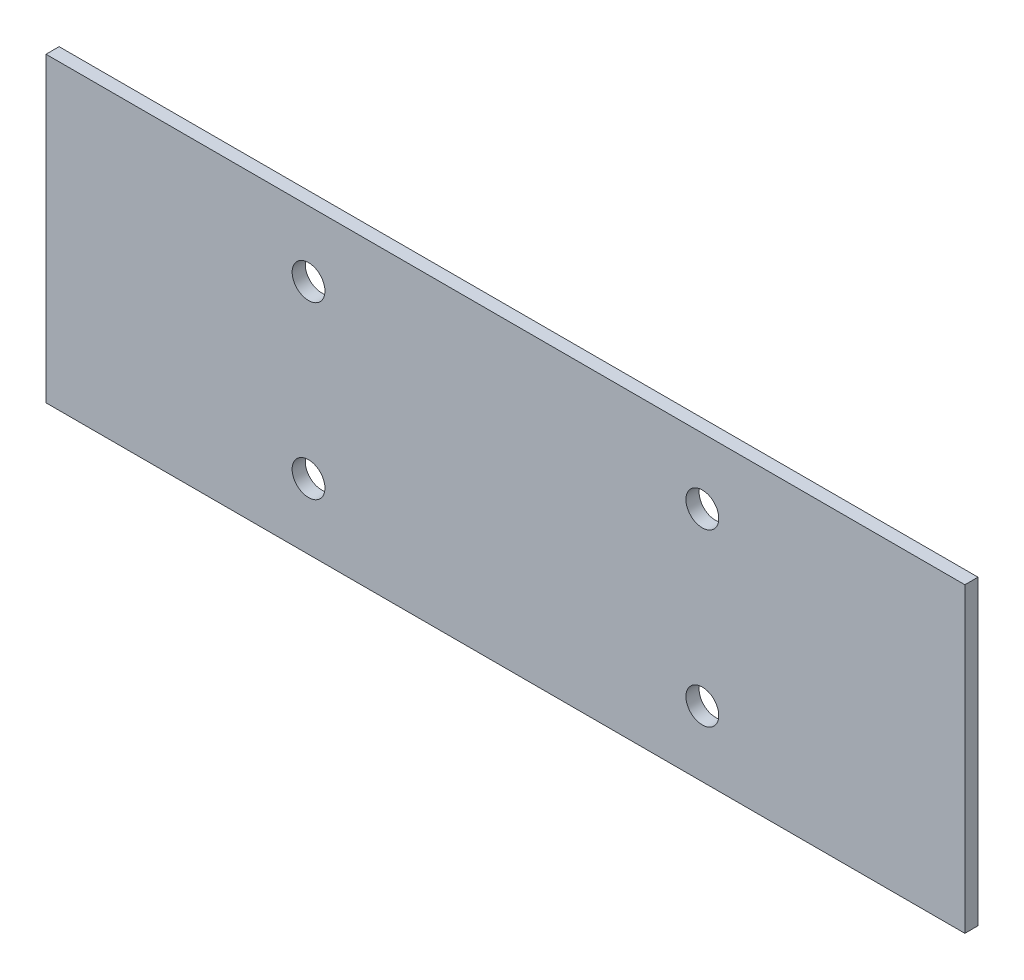
ISO-10303-21;
HEADER;
FILE_DESCRIPTION(('STEP AP214'),'2;1');
FILE_NAME('part.step','',(''),(''),'','','');
FILE_SCHEMA(('AUTOMOTIVE_DESIGN { 1 0 10303 214 1 1 1 1 }'));
ENDSEC;
DATA;
#1=APPLICATION_CONTEXT('core data for automotive mechanical design processes');
#2=APPLICATION_PROTOCOL_DEFINITION('international standard','automotive_design',2000,#1);
#3=PRODUCT_CONTEXT('',#1,'mechanical');
#4=PRODUCT('Part','Part','',(#3));
#5=PRODUCT_RELATED_PRODUCT_CATEGORY('part','',(#4));
#6=PRODUCT_DEFINITION_FORMATION('','',#4);
#7=PRODUCT_DEFINITION_CONTEXT('part definition',#1,'design');
#8=PRODUCT_DEFINITION('design','',#6,#7);
#9=PRODUCT_DEFINITION_SHAPE('','',#8);
#10=(LENGTH_UNIT() NAMED_UNIT(*) SI_UNIT(.MILLI.,.METRE.));
#11=(NAMED_UNIT(*) PLANE_ANGLE_UNIT() SI_UNIT($,.RADIAN.));
#12=(NAMED_UNIT(*) SI_UNIT($,.STERADIAN.) SOLID_ANGLE_UNIT());
#13=UNCERTAINTY_MEASURE_WITH_UNIT(LENGTH_MEASURE(1.E-05),#10,'distance_accuracy_value','');
#14=(GEOMETRIC_REPRESENTATION_CONTEXT(3) GLOBAL_UNCERTAINTY_ASSIGNED_CONTEXT((#13)) GLOBAL_UNIT_ASSIGNED_CONTEXT((#10,
#11,#12)) REPRESENTATION_CONTEXT('',''));
#15=CARTESIAN_POINT('',(0.,0.,0.));
#16=DIRECTION('',(0.,0.,1.));
#17=DIRECTION('',(1.,0.,0.));
#18=AXIS2_PLACEMENT_3D('',#15,#16,#17);
#19=CARTESIAN_POINT('',(0.,0.,2.));
#20=DIRECTION('',(0.,0.,-1.));
#21=DIRECTION('',(-1.,0.,0.));
#22=AXIS2_PLACEMENT_3D('',#19,#20,#21);
#23=PLANE('',#22);
#24=DIRECTION('',(0.,-1.,0.));
#25=VECTOR('',#24,1.);
#26=CARTESIAN_POINT('',(0.,0.,2.));
#27=LINE('',#26,#25);
#28=CARTESIAN_POINT('',(0.,46.,2.));
#29=VERTEX_POINT('',#28);
#30=CARTESIAN_POINT('',(0.,0.,2.));
#31=VERTEX_POINT('',#30);
#32=EDGE_CURVE('E88',#29,#31,#27,.T.);
#33=ORIENTED_EDGE('',*,*,#32,.T.);
#34=DIRECTION('',(1.,0.,0.));
#35=VECTOR('',#34,1.);
#36=CARTESIAN_POINT('',(0.,0.,2.));
#37=LINE('',#36,#35);
#38=CARTESIAN_POINT('',(140.,0.,2.));
#39=VERTEX_POINT('',#38);
#40=EDGE_CURVE('E83',#31,#39,#37,.T.);
#41=ORIENTED_EDGE('',*,*,#40,.T.);
#42=DIRECTION('',(0.,1.,0.));
#43=VECTOR('',#42,1.);
#44=CARTESIAN_POINT('',(140.,0.,2.));
#45=LINE('',#44,#43);
#46=CARTESIAN_POINT('',(140.,46.,2.));
#47=VERTEX_POINT('',#46);
#48=EDGE_CURVE('E86',#39,#47,#45,.T.);
#49=ORIENTED_EDGE('',*,*,#48,.T.);
#50=DIRECTION('',(-1.,0.,0.));
#51=VECTOR('',#50,1.);
#52=CARTESIAN_POINT('',(0.,46.,2.));
#53=LINE('',#52,#51);
#54=EDGE_CURVE('E53',#47,#29,#53,.T.);
#55=ORIENTED_EDGE('',*,*,#54,.T.);
#56=EDGE_LOOP('',(#33,#41,#49,#55));
#57=FACE_BOUND('',#56,.T.);
#58=CARTESIAN_POINT('',(40.,36.,2.));
#59=DIRECTION('',(0.,0.,1.));
#60=DIRECTION('',(1.,0.,0.));
#61=AXIS2_PLACEMENT_3D('',#58,#59,#60);
#62=CIRCLE('',#61,2.5);
#63=CARTESIAN_POINT('',(42.5,36.,2.));
#64=VERTEX_POINT('',#63);
#65=EDGE_CURVE('E103',#64,#64,#62,.T.);
#66=ORIENTED_EDGE('',*,*,#65,.F.);
#67=EDGE_LOOP('',(#66));
#68=FACE_BOUND('',#67,.T.);
#69=CARTESIAN_POINT('',(100.,36.,2.));
#70=DIRECTION('',(0.,0.,1.));
#71=DIRECTION('',(1.,0.,0.));
#72=AXIS2_PLACEMENT_3D('',#69,#70,#71);
#73=CIRCLE('',#72,2.5);
#74=CARTESIAN_POINT('',(102.5,36.,2.));
#75=VERTEX_POINT('',#74);
#76=EDGE_CURVE('E118',#75,#75,#73,.T.);
#77=ORIENTED_EDGE('',*,*,#76,.F.);
#78=EDGE_LOOP('',(#77));
#79=FACE_BOUND('',#78,.T.);
#80=CARTESIAN_POINT('',(40.,9.99999999999999,2.));
#81=DIRECTION('',(0.,0.,1.));
#82=DIRECTION('',(1.,0.,0.));
#83=AXIS2_PLACEMENT_3D('',#80,#81,#82);
#84=CIRCLE('',#83,2.5);
#85=CARTESIAN_POINT('',(42.5,9.99999999999999,2.));
#86=VERTEX_POINT('',#85);
#87=EDGE_CURVE('E124',#86,#86,#84,.T.);
#88=ORIENTED_EDGE('',*,*,#87,.F.);
#89=EDGE_LOOP('',(#88));
#90=FACE_BOUND('',#89,.T.);
#91=CARTESIAN_POINT('',(100.,9.99999999999999,2.));
#92=DIRECTION('',(0.,0.,1.));
#93=DIRECTION('',(1.,0.,0.));
#94=AXIS2_PLACEMENT_3D('',#91,#92,#93);
#95=CIRCLE('',#94,2.50000000000001);
#96=CARTESIAN_POINT('',(102.5,9.99999999999999,2.));
#97=VERTEX_POINT('',#96);
#98=EDGE_CURVE('E130',#97,#97,#95,.T.);
#99=ORIENTED_EDGE('',*,*,#98,.F.);
#100=EDGE_LOOP('',(#99));
#101=FACE_BOUND('',#100,.T.);
#102=ADVANCED_FACE('F36',(#57,#68,#79,#90,#101),#23,.F.);
#103=CARTESIAN_POINT('',(0.,0.,0.));
#104=DIRECTION('',(0.,0.,-1.));
#105=DIRECTION('',(-1.,0.,0.));
#106=AXIS2_PLACEMENT_3D('',#103,#104,#105);
#107=PLANE('',#106);
#108=CARTESIAN_POINT('',(40.,9.99999999999999,0.));
#109=DIRECTION('',(0.,0.,1.));
#110=DIRECTION('',(1.,0.,0.));
#111=AXIS2_PLACEMENT_3D('',#108,#109,#110);
#112=CIRCLE('',#111,2.5);
#113=CARTESIAN_POINT('',(42.5,9.99999999999999,0.));
#114=VERTEX_POINT('',#113);
#115=EDGE_CURVE('E127',#114,#114,#112,.T.);
#116=ORIENTED_EDGE('',*,*,#115,.T.);
#117=EDGE_LOOP('',(#116));
#118=FACE_BOUND('',#117,.T.);
#119=CARTESIAN_POINT('',(40.,36.,0.));
#120=DIRECTION('',(0.,0.,1.));
#121=DIRECTION('',(1.,0.,0.));
#122=AXIS2_PLACEMENT_3D('',#119,#120,#121);
#123=CIRCLE('',#122,2.5);
#124=CARTESIAN_POINT('',(42.5,36.,0.));
#125=VERTEX_POINT('',#124);
#126=EDGE_CURVE('E115',#125,#125,#123,.T.);
#127=ORIENTED_EDGE('',*,*,#126,.T.);
#128=EDGE_LOOP('',(#127));
#129=FACE_BOUND('',#128,.T.);
#130=DIRECTION('',(0.,-1.,0.));
#131=VECTOR('',#130,1.);
#132=CARTESIAN_POINT('',(0.,0.,0.));
#133=LINE('',#132,#131);
#134=CARTESIAN_POINT('',(0.,46.,0.));
#135=VERTEX_POINT('',#134);
#136=CARTESIAN_POINT('',(0.,0.,0.));
#137=VERTEX_POINT('',#136);
#138=EDGE_CURVE('E100',#135,#137,#133,.T.);
#139=ORIENTED_EDGE('',*,*,#138,.F.);
#140=DIRECTION('',(-1.,0.,0.));
#141=VECTOR('',#140,1.);
#142=CARTESIAN_POINT('',(0.,46.,0.));
#143=LINE('',#142,#141);
#144=CARTESIAN_POINT('',(140.,46.,0.));
#145=VERTEX_POINT('',#144);
#146=EDGE_CURVE('E76',#145,#135,#143,.T.);
#147=ORIENTED_EDGE('',*,*,#146,.F.);
#148=DIRECTION('',(0.,1.,0.));
#149=VECTOR('',#148,1.);
#150=CARTESIAN_POINT('',(140.,0.,0.));
#151=LINE('',#150,#149);
#152=CARTESIAN_POINT('',(140.,0.,0.));
#153=VERTEX_POINT('',#152);
#154=EDGE_CURVE('E70',#153,#145,#151,.T.);
#155=ORIENTED_EDGE('',*,*,#154,.F.);
#156=DIRECTION('',(1.,0.,0.));
#157=VECTOR('',#156,1.);
#158=CARTESIAN_POINT('',(0.,0.,0.));
#159=LINE('',#158,#157);
#160=EDGE_CURVE('E92',#137,#153,#159,.T.);
#161=ORIENTED_EDGE('',*,*,#160,.F.);
#162=EDGE_LOOP('',(#139,#147,#155,#161));
#163=FACE_BOUND('',#162,.T.);
#164=CARTESIAN_POINT('',(100.,36.,0.));
#165=DIRECTION('',(0.,0.,1.));
#166=DIRECTION('',(1.,0.,0.));
#167=AXIS2_PLACEMENT_3D('',#164,#165,#166);
#168=CIRCLE('',#167,2.5);
#169=CARTESIAN_POINT('',(102.5,36.,0.));
#170=VERTEX_POINT('',#169);
#171=EDGE_CURVE('E121',#170,#170,#168,.T.);
#172=ORIENTED_EDGE('',*,*,#171,.T.);
#173=EDGE_LOOP('',(#172));
#174=FACE_BOUND('',#173,.T.);
#175=CARTESIAN_POINT('',(100.,9.99999999999999,0.));
#176=DIRECTION('',(0.,0.,1.));
#177=DIRECTION('',(1.,0.,0.));
#178=AXIS2_PLACEMENT_3D('',#175,#176,#177);
#179=CIRCLE('',#178,2.50000000000001);
#180=CARTESIAN_POINT('',(102.5,9.99999999999999,0.));
#181=VERTEX_POINT('',#180);
#182=EDGE_CURVE('E133',#181,#181,#179,.T.);
#183=ORIENTED_EDGE('',*,*,#182,.T.);
#184=EDGE_LOOP('',(#183));
#185=FACE_BOUND('',#184,.T.);
#186=ADVANCED_FACE('F111',(#118,#129,#163,#174,#185),#107,.T.);
#187=CARTESIAN_POINT('',(0.,0.,2.));
#188=DIRECTION('',(1.,0.,0.));
#189=DIRECTION('',(0.,0.,-1.));
#190=AXIS2_PLACEMENT_3D('',#187,#188,#189);
#191=PLANE('',#190);
#192=ORIENTED_EDGE('',*,*,#138,.T.);
#193=DIRECTION('',(0.,0.,-1.));
#194=VECTOR('',#193,1.);
#195=CARTESIAN_POINT('',(0.,0.,2.));
#196=LINE('',#195,#194);
#197=EDGE_CURVE('E11',#31,#137,#196,.T.);
#198=ORIENTED_EDGE('',*,*,#197,.F.);
#199=ORIENTED_EDGE('',*,*,#32,.F.);
#200=DIRECTION('',(0.,0.,-1.));
#201=VECTOR('',#200,1.);
#202=CARTESIAN_POINT('',(0.,46.,2.));
#203=LINE('',#202,#201);
#204=EDGE_CURVE('E96',#29,#135,#203,.T.);
#205=ORIENTED_EDGE('',*,*,#204,.T.);
#206=EDGE_LOOP('',(#192,#198,#199,#205));
#207=FACE_BOUND('',#206,.T.);
#208=ADVANCED_FACE('F38',(#207),#191,.F.);
#209=CARTESIAN_POINT('',(0.,0.,2.));
#210=DIRECTION('',(0.,1.,0.));
#211=DIRECTION('',(0.,0.,1.));
#212=AXIS2_PLACEMENT_3D('',#209,#210,#211);
#213=PLANE('',#212);
#214=ORIENTED_EDGE('',*,*,#160,.T.);
#215=DIRECTION('',(0.,0.,-1.));
#216=VECTOR('',#215,1.);
#217=CARTESIAN_POINT('',(140.,0.,2.));
#218=LINE('',#217,#216);
#219=EDGE_CURVE('E45',#39,#153,#218,.T.);
#220=ORIENTED_EDGE('',*,*,#219,.F.);
#221=ORIENTED_EDGE('',*,*,#40,.F.);
#222=ORIENTED_EDGE('',*,*,#197,.T.);
#223=EDGE_LOOP('',(#214,#220,#221,#222));
#224=FACE_BOUND('',#223,.T.);
#225=ADVANCED_FACE('F91',(#224),#213,.F.);
#226=CARTESIAN_POINT('',(140.,0.,2.));
#227=DIRECTION('',(-1.,0.,0.));
#228=DIRECTION('',(0.,0.,1.));
#229=AXIS2_PLACEMENT_3D('',#226,#227,#228);
#230=PLANE('',#229);
#231=ORIENTED_EDGE('',*,*,#154,.T.);
#232=DIRECTION('',(0.,0.,-1.));
#233=VECTOR('',#232,1.);
#234=CARTESIAN_POINT('',(140.,46.,2.));
#235=LINE('',#234,#233);
#236=EDGE_CURVE('E93',#47,#145,#235,.T.);
#237=ORIENTED_EDGE('',*,*,#236,.F.);
#238=ORIENTED_EDGE('',*,*,#48,.F.);
#239=ORIENTED_EDGE('',*,*,#219,.T.);
#240=EDGE_LOOP('',(#231,#237,#238,#239));
#241=FACE_BOUND('',#240,.T.);
#242=ADVANCED_FACE('F94',(#241),#230,.F.);
#243=CARTESIAN_POINT('',(0.,46.,2.));
#244=DIRECTION('',(0.,-1.,0.));
#245=DIRECTION('',(0.,0.,-1.));
#246=AXIS2_PLACEMENT_3D('',#243,#244,#245);
#247=PLANE('',#246);
#248=ORIENTED_EDGE('',*,*,#146,.T.);
#249=ORIENTED_EDGE('',*,*,#204,.F.);
#250=ORIENTED_EDGE('',*,*,#54,.F.);
#251=ORIENTED_EDGE('',*,*,#236,.T.);
#252=EDGE_LOOP('',(#248,#249,#250,#251));
#253=FACE_BOUND('',#252,.T.);
#254=ADVANCED_FACE('F108',(#253),#247,.F.);
#255=CARTESIAN_POINT('',(40.,36.,2.));
#256=DIRECTION('',(0.,0.,-1.));
#257=DIRECTION('',(-1.,0.,0.));
#258=AXIS2_PLACEMENT_3D('',#255,#256,#257);
#259=CYLINDRICAL_SURFACE('',#258,2.5);
#260=ORIENTED_EDGE('',*,*,#65,.T.);
#261=EDGE_LOOP('',(#260));
#262=FACE_BOUND('',#261,.T.);
#263=ORIENTED_EDGE('',*,*,#126,.F.);
#264=EDGE_LOOP('',(#263));
#265=FACE_BOUND('',#264,.T.);
#266=ADVANCED_FACE('F150',(#262,#265),#259,.F.);
#267=CARTESIAN_POINT('',(100.,36.,2.));
#268=DIRECTION('',(0.,0.,-1.));
#269=DIRECTION('',(-1.,0.,0.));
#270=AXIS2_PLACEMENT_3D('',#267,#268,#269);
#271=CYLINDRICAL_SURFACE('',#270,2.5);
#272=ORIENTED_EDGE('',*,*,#76,.T.);
#273=EDGE_LOOP('',(#272));
#274=FACE_BOUND('',#273,.T.);
#275=ORIENTED_EDGE('',*,*,#171,.F.);
#276=EDGE_LOOP('',(#275));
#277=FACE_BOUND('',#276,.T.);
#278=ADVANCED_FACE('F196',(#274,#277),#271,.F.);
#279=CARTESIAN_POINT('',(40.,9.99999999999999,2.));
#280=DIRECTION('',(0.,0.,-1.));
#281=DIRECTION('',(-1.,0.,0.));
#282=AXIS2_PLACEMENT_3D('',#279,#280,#281);
#283=CYLINDRICAL_SURFACE('',#282,2.5);
#284=ORIENTED_EDGE('',*,*,#87,.T.);
#285=EDGE_LOOP('',(#284));
#286=FACE_BOUND('',#285,.T.);
#287=ORIENTED_EDGE('',*,*,#115,.F.);
#288=EDGE_LOOP('',(#287));
#289=FACE_BOUND('',#288,.T.);
#290=ADVANCED_FACE('F204',(#286,#289),#283,.F.);
#291=CARTESIAN_POINT('',(100.,9.99999999999999,2.));
#292=DIRECTION('',(0.,0.,-1.));
#293=DIRECTION('',(-1.,0.,0.));
#294=AXIS2_PLACEMENT_3D('',#291,#292,#293);
#295=CYLINDRICAL_SURFACE('',#294,2.50000000000001);
#296=ORIENTED_EDGE('',*,*,#98,.T.);
#297=EDGE_LOOP('',(#296));
#298=FACE_BOUND('',#297,.T.);
#299=ORIENTED_EDGE('',*,*,#182,.F.);
#300=EDGE_LOOP('',(#299));
#301=FACE_BOUND('',#300,.T.);
#302=ADVANCED_FACE('F139',(#298,#301),#295,.F.);
#303=CLOSED_SHELL('',(#102,#186,#208,#225,#242,#254,#266,#278,#290,#302));
#304=MANIFOLD_SOLID_BREP('B2',#303);
#305=ADVANCED_BREP_SHAPE_REPRESENTATION('',(#18,#304),#14);
#306=SHAPE_DEFINITION_REPRESENTATION(#9,#305);
ENDSEC;
END-ISO-10303-21;
